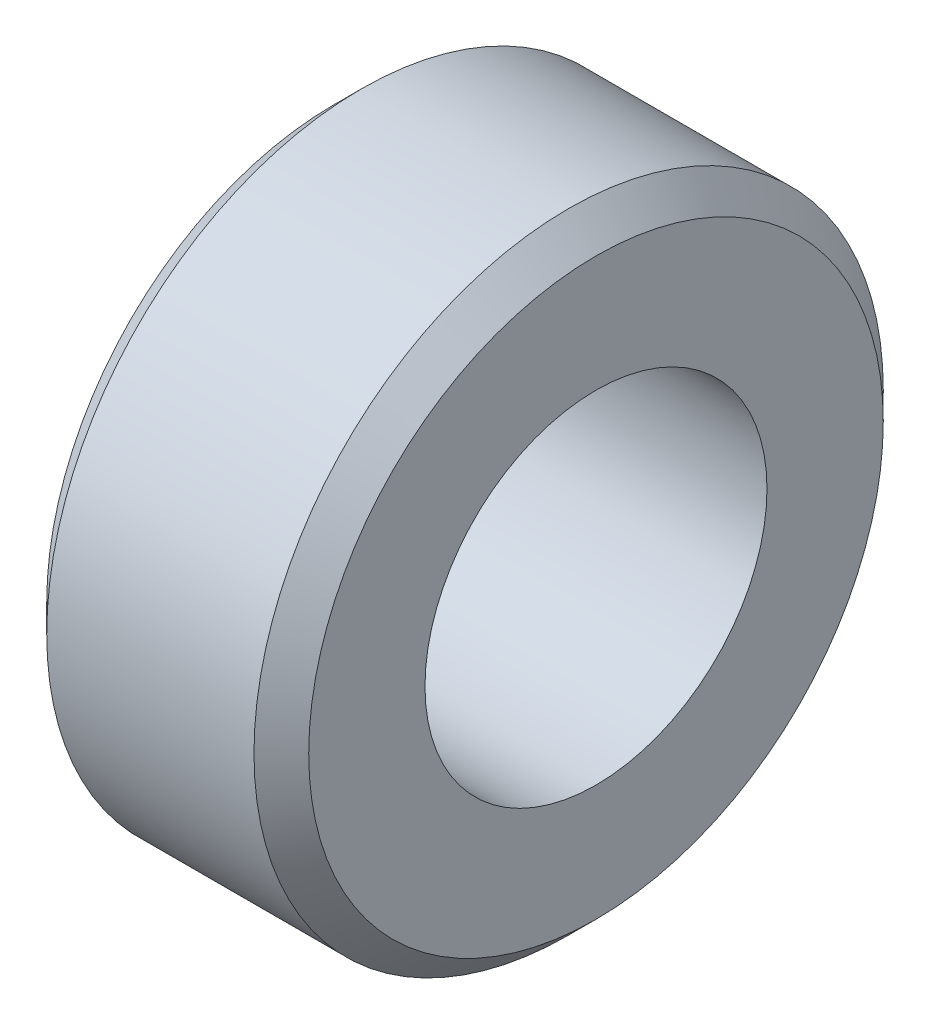
ISO-10303-21;
HEADER;
FILE_DESCRIPTION(('STEP AP214'),'2;1');
FILE_NAME('part.step','',(''),(''),'','','');
FILE_SCHEMA(('AUTOMOTIVE_DESIGN { 1 0 10303 214 1 1 1 1 }'));
ENDSEC;
DATA;
#1=APPLICATION_CONTEXT('core data for automotive mechanical design processes');
#2=APPLICATION_PROTOCOL_DEFINITION('international standard','automotive_design',2000,#1);
#3=PRODUCT_CONTEXT('',#1,'mechanical');
#4=PRODUCT('Part','Part','',(#3));
#5=PRODUCT_RELATED_PRODUCT_CATEGORY('part','',(#4));
#6=PRODUCT_DEFINITION_FORMATION('','',#4);
#7=PRODUCT_DEFINITION_CONTEXT('part definition',#1,'design');
#8=PRODUCT_DEFINITION('design','',#6,#7);
#9=PRODUCT_DEFINITION_SHAPE('','',#8);
#10=(LENGTH_UNIT() NAMED_UNIT(*) SI_UNIT(.MILLI.,.METRE.));
#11=(NAMED_UNIT(*) PLANE_ANGLE_UNIT() SI_UNIT($,.RADIAN.));
#12=(NAMED_UNIT(*) SI_UNIT($,.STERADIAN.) SOLID_ANGLE_UNIT());
#13=UNCERTAINTY_MEASURE_WITH_UNIT(LENGTH_MEASURE(1.E-05),#10,'distance_accuracy_value','');
#14=(GEOMETRIC_REPRESENTATION_CONTEXT(3) GLOBAL_UNCERTAINTY_ASSIGNED_CONTEXT((#13)) GLOBAL_UNIT_ASSIGNED_CONTEXT((#10,
#11,#12)) REPRESENTATION_CONTEXT('',''));
#15=CARTESIAN_POINT('',(0.,0.,0.));
#16=DIRECTION('',(0.,0.,1.));
#17=DIRECTION('',(1.,0.,0.));
#18=AXIS2_PLACEMENT_3D('',#15,#16,#17);
#19=CARTESIAN_POINT('',(-9.575,12.5,0.));
#20=DIRECTION('',(1.,0.,0.));
#21=DIRECTION('',(0.,0.,-1.));
#22=AXIS2_PLACEMENT_3D('',#19,#20,#21);
#23=PLANE('',#22);
#24=CARTESIAN_POINT('',(-9.575,0.,0.));
#25=DIRECTION('',(-1.,0.,0.));
#26=DIRECTION('',(0.,0.,1.));
#27=AXIS2_PLACEMENT_3D('',#24,#25,#26);
#28=CIRCLE('',#27,12.5);
#29=CARTESIAN_POINT('',(-9.575,0.,12.5));
#30=VERTEX_POINT('',#29);
#31=EDGE_CURVE('E59',#30,#30,#28,.T.);
#32=ORIENTED_EDGE('',*,*,#31,.F.);
#33=EDGE_LOOP('',(#32));
#34=FACE_BOUND('',#33,.T.);
#35=CARTESIAN_POINT('',(-9.575,0.,0.));
#36=DIRECTION('',(-1.,0.,0.));
#37=DIRECTION('',(0.,0.,1.));
#38=AXIS2_PLACEMENT_3D('',#35,#36,#37);
#39=CIRCLE('',#38,21.);
#40=CARTESIAN_POINT('',(-9.575,0.,21.));
#41=VERTEX_POINT('',#40);
#42=EDGE_CURVE('E10',#41,#41,#39,.T.);
#43=ORIENTED_EDGE('',*,*,#42,.T.);
#44=EDGE_LOOP('',(#43));
#45=FACE_BOUND('',#44,.T.);
#46=ADVANCED_FACE('F37',(#34,#45),#23,.F.);
#47=CARTESIAN_POINT('',(-7.575,0.,0.));
#48=DIRECTION('',(1.,0.,0.));
#49=DIRECTION('',(0.,0.,-1.));
#50=AXIS2_PLACEMENT_3D('',#47,#48,#49);
#51=CONICAL_SURFACE('',#50,23.,0.785398163397449);
#52=ORIENTED_EDGE('',*,*,#42,.F.);
#53=EDGE_LOOP('',(#52));
#54=FACE_BOUND('',#53,.T.);
#55=CARTESIAN_POINT('',(-7.575,0.,0.));
#56=DIRECTION('',(-1.,0.,0.));
#57=DIRECTION('',(0.,0.,1.));
#58=AXIS2_PLACEMENT_3D('',#55,#56,#57);
#59=CIRCLE('',#58,23.);
#60=CARTESIAN_POINT('',(-7.575,0.,23.));
#61=VERTEX_POINT('',#60);
#62=EDGE_CURVE('E43',#61,#61,#59,.T.);
#63=ORIENTED_EDGE('',*,*,#62,.T.);
#64=EDGE_LOOP('',(#63));
#65=FACE_BOUND('',#64,.T.);
#66=ADVANCED_FACE('F66',(#54,#65),#51,.T.);
#67=CARTESIAN_POINT('',(-9.575,0.,0.));
#68=DIRECTION('',(-1.,0.,0.));
#69=DIRECTION('',(0.,0.,1.));
#70=AXIS2_PLACEMENT_3D('',#67,#68,#69);
#71=CYLINDRICAL_SURFACE('',#70,23.);
#72=ORIENTED_EDGE('',*,*,#62,.F.);
#73=EDGE_LOOP('',(#72));
#74=FACE_BOUND('',#73,.T.);
#75=CARTESIAN_POINT('',(7.575,0.,0.));
#76=DIRECTION('',(-1.,0.,0.));
#77=DIRECTION('',(0.,0.,1.));
#78=AXIS2_PLACEMENT_3D('',#75,#76,#77);
#79=CIRCLE('',#78,23.);
#80=CARTESIAN_POINT('',(7.575,0.,23.));
#81=VERTEX_POINT('',#80);
#82=EDGE_CURVE('E47',#81,#81,#79,.T.);
#83=ORIENTED_EDGE('',*,*,#82,.T.);
#84=EDGE_LOOP('',(#83));
#85=FACE_BOUND('',#84,.T.);
#86=ADVANCED_FACE('F70',(#74,#85),#71,.T.);
#87=CARTESIAN_POINT('',(9.575,0.,0.));
#88=DIRECTION('',(-1.,0.,0.));
#89=DIRECTION('',(0.,0.,1.));
#90=AXIS2_PLACEMENT_3D('',#87,#88,#89);
#91=CONICAL_SURFACE('',#90,21.,0.785398163397449);
#92=ORIENTED_EDGE('',*,*,#82,.F.);
#93=EDGE_LOOP('',(#92));
#94=FACE_BOUND('',#93,.T.);
#95=CARTESIAN_POINT('',(9.575,0.,0.));
#96=DIRECTION('',(-1.,0.,0.));
#97=DIRECTION('',(0.,0.,1.));
#98=AXIS2_PLACEMENT_3D('',#95,#96,#97);
#99=CIRCLE('',#98,21.);
#100=CARTESIAN_POINT('',(9.575,0.,21.));
#101=VERTEX_POINT('',#100);
#102=EDGE_CURVE('E51',#101,#101,#99,.T.);
#103=ORIENTED_EDGE('',*,*,#102,.T.);
#104=EDGE_LOOP('',(#103));
#105=FACE_BOUND('',#104,.T.);
#106=ADVANCED_FACE('F75',(#94,#105),#91,.T.);
#107=CARTESIAN_POINT('',(9.575,12.5,0.));
#108=DIRECTION('',(-1.,0.,0.));
#109=DIRECTION('',(0.,0.,1.));
#110=AXIS2_PLACEMENT_3D('',#107,#108,#109);
#111=PLANE('',#110);
#112=ORIENTED_EDGE('',*,*,#102,.F.);
#113=EDGE_LOOP('',(#112));
#114=FACE_BOUND('',#113,.T.);
#115=CARTESIAN_POINT('',(9.575,0.,0.));
#116=DIRECTION('',(-1.,0.,0.));
#117=DIRECTION('',(0.,0.,1.));
#118=AXIS2_PLACEMENT_3D('',#115,#116,#117);
#119=CIRCLE('',#118,12.5);
#120=CARTESIAN_POINT('',(9.575,0.,12.5));
#121=VERTEX_POINT('',#120);
#122=EDGE_CURVE('E56',#121,#121,#119,.T.);
#123=ORIENTED_EDGE('',*,*,#122,.T.);
#124=EDGE_LOOP('',(#123));
#125=FACE_BOUND('',#124,.T.);
#126=ADVANCED_FACE('F81',(#114,#125),#111,.F.);
#127=CARTESIAN_POINT('',(-9.575,0.,0.));
#128=DIRECTION('',(-1.,0.,0.));
#129=DIRECTION('',(0.,0.,1.));
#130=AXIS2_PLACEMENT_3D('',#127,#128,#129);
#131=CYLINDRICAL_SURFACE('',#130,12.5);
#132=ORIENTED_EDGE('',*,*,#122,.F.);
#133=EDGE_LOOP('',(#132));
#134=FACE_BOUND('',#133,.T.);
#135=ORIENTED_EDGE('',*,*,#31,.T.);
#136=EDGE_LOOP('',(#135));
#137=FACE_BOUND('',#136,.T.);
#138=ADVANCED_FACE('F63',(#134,#137),#131,.F.);
#139=CLOSED_SHELL('',(#46,#66,#86,#106,#126,#138));
#140=MANIFOLD_SOLID_BREP('B2',#139);
#141=ADVANCED_BREP_SHAPE_REPRESENTATION('',(#18,#140),#14);
#142=SHAPE_DEFINITION_REPRESENTATION(#9,#141);
ENDSEC;
END-ISO-10303-21;
